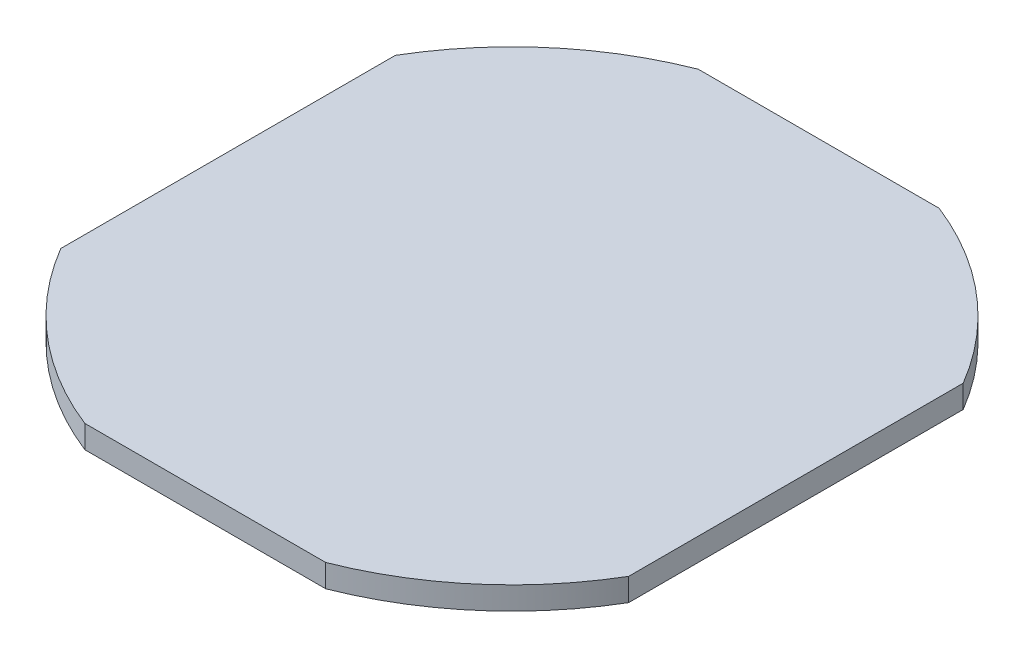
ISO-10303-21;
HEADER;
FILE_DESCRIPTION(('STEP AP214'),'2;1');
FILE_NAME('part.step','',(''),(''),'','','');
FILE_SCHEMA(('AUTOMOTIVE_DESIGN { 1 0 10303 214 1 1 1 1 }'));
ENDSEC;
DATA;
#1=APPLICATION_CONTEXT('core data for automotive mechanical design processes');
#2=APPLICATION_PROTOCOL_DEFINITION('international standard','automotive_design',2000,#1);
#3=PRODUCT_CONTEXT('',#1,'mechanical');
#4=PRODUCT('Part','Part','',(#3));
#5=PRODUCT_RELATED_PRODUCT_CATEGORY('part','',(#4));
#6=PRODUCT_DEFINITION_FORMATION('','',#4);
#7=PRODUCT_DEFINITION_CONTEXT('part definition',#1,'design');
#8=PRODUCT_DEFINITION('design','',#6,#7);
#9=PRODUCT_DEFINITION_SHAPE('','',#8);
#10=(LENGTH_UNIT() NAMED_UNIT(*) SI_UNIT(.MILLI.,.METRE.));
#11=(NAMED_UNIT(*) PLANE_ANGLE_UNIT() SI_UNIT($,.RADIAN.));
#12=(NAMED_UNIT(*) SI_UNIT($,.STERADIAN.) SOLID_ANGLE_UNIT());
#13=UNCERTAINTY_MEASURE_WITH_UNIT(LENGTH_MEASURE(1.E-05),#10,'distance_accuracy_value','');
#14=(GEOMETRIC_REPRESENTATION_CONTEXT(3) GLOBAL_UNCERTAINTY_ASSIGNED_CONTEXT((#13)) GLOBAL_UNIT_ASSIGNED_CONTEXT((#10,
#11,#12)) REPRESENTATION_CONTEXT('',''));
#15=CARTESIAN_POINT('',(0.,0.,0.));
#16=DIRECTION('',(0.,0.,1.));
#17=DIRECTION('',(1.,0.,0.));
#18=AXIS2_PLACEMENT_3D('',#15,#16,#17);
#19=CARTESIAN_POINT('',(0.,5.,0.));
#20=DIRECTION('',(0.,-1.,0.));
#21=DIRECTION('',(0.,0.,-1.));
#22=AXIS2_PLACEMENT_3D('',#19,#20,#21);
#23=CYLINDRICAL_SURFACE('',#22,72.25);
#24=CARTESIAN_POINT('',(0.,0.,0.));
#25=DIRECTION('',(0.,1.,0.));
#26=DIRECTION('',(0.,0.,1.));
#27=AXIS2_PLACEMENT_3D('',#24,#25,#26);
#28=CIRCLE('',#27,72.25);
#29=CARTESIAN_POINT('',(-26.4102252924885,0.,-67.25));
#30=VERTEX_POINT('',#29);
#31=CARTESIAN_POINT('',(-62.25,0.,-36.6742416417844));
#32=VERTEX_POINT('',#31);
#33=EDGE_CURVE('E129',#30,#32,#28,.T.);
#34=ORIENTED_EDGE('',*,*,#33,.T.);
#35=DIRECTION('',(0.,-1.,0.));
#36=VECTOR('',#35,1.);
#37=CARTESIAN_POINT('',(-62.25,5.,-36.6742416417844));
#38=LINE('',#37,#36);
#39=CARTESIAN_POINT('',(-62.25,5.,-36.6742416417844));
#40=VERTEX_POINT('',#39);
#41=EDGE_CURVE('E11',#40,#32,#38,.T.);
#42=ORIENTED_EDGE('',*,*,#41,.F.);
#43=CARTESIAN_POINT('',(0.,5.,0.));
#44=DIRECTION('',(0.,1.,0.));
#45=DIRECTION('',(0.,0.,1.));
#46=AXIS2_PLACEMENT_3D('',#43,#44,#45);
#47=CIRCLE('',#46,72.25);
#48=CARTESIAN_POINT('',(-26.4102252924885,5.,-67.25));
#49=VERTEX_POINT('',#48);
#50=EDGE_CURVE('E143',#49,#40,#47,.T.);
#51=ORIENTED_EDGE('',*,*,#50,.F.);
#52=DIRECTION('',(0.,-1.,0.));
#53=VECTOR('',#52,1.);
#54=CARTESIAN_POINT('',(-26.4102252924885,5.,-67.25));
#55=LINE('',#54,#53);
#56=EDGE_CURVE('E125',#49,#30,#55,.T.);
#57=ORIENTED_EDGE('',*,*,#56,.T.);
#58=EDGE_LOOP('',(#34,#42,#51,#57));
#59=FACE_BOUND('',#58,.T.);
#60=ADVANCED_FACE('F33',(#59),#23,.T.);
#61=CARTESIAN_POINT('',(-62.25,5.,36.6742416417844));
#62=DIRECTION('',(1.,0.,0.));
#63=DIRECTION('',(0.,0.,-1.));
#64=AXIS2_PLACEMENT_3D('',#61,#62,#63);
#65=PLANE('',#64);
#66=DIRECTION('',(0.,0.,1.));
#67=VECTOR('',#66,1.);
#68=CARTESIAN_POINT('',(-62.25,0.,36.6742416417844));
#69=LINE('',#68,#67);
#70=CARTESIAN_POINT('',(-62.25,0.,36.6742416417844));
#71=VERTEX_POINT('',#70);
#72=EDGE_CURVE('E132',#32,#71,#69,.T.);
#73=ORIENTED_EDGE('',*,*,#72,.T.);
#74=DIRECTION('',(0.,-1.,0.));
#75=VECTOR('',#74,1.);
#76=CARTESIAN_POINT('',(-62.25,5.,36.6742416417844));
#77=LINE('',#76,#75);
#78=CARTESIAN_POINT('',(-62.25,5.,36.6742416417844));
#79=VERTEX_POINT('',#78);
#80=EDGE_CURVE('E41',#79,#71,#77,.T.);
#81=ORIENTED_EDGE('',*,*,#80,.F.);
#82=DIRECTION('',(0.,0.,1.));
#83=VECTOR('',#82,1.);
#84=CARTESIAN_POINT('',(-62.25,5.,36.6742416417844));
#85=LINE('',#84,#83);
#86=EDGE_CURVE('E92',#40,#79,#85,.T.);
#87=ORIENTED_EDGE('',*,*,#86,.F.);
#88=ORIENTED_EDGE('',*,*,#41,.T.);
#89=EDGE_LOOP('',(#73,#81,#87,#88));
#90=FACE_BOUND('',#89,.T.);
#91=ADVANCED_FACE('F178',(#90),#65,.F.);
#92=CARTESIAN_POINT('',(0.,5.,0.));
#93=DIRECTION('',(0.,-1.,0.));
#94=DIRECTION('',(0.,0.,-1.));
#95=AXIS2_PLACEMENT_3D('',#92,#93,#94);
#96=CYLINDRICAL_SURFACE('',#95,72.25);
#97=CARTESIAN_POINT('',(0.,0.,0.));
#98=DIRECTION('',(0.,1.,0.));
#99=DIRECTION('',(0.,0.,1.));
#100=AXIS2_PLACEMENT_3D('',#97,#98,#99);
#101=CIRCLE('',#100,72.25);
#102=CARTESIAN_POINT('',(-26.4102252924885,0.,67.25));
#103=VERTEX_POINT('',#102);
#104=EDGE_CURVE('E134',#71,#103,#101,.T.);
#105=ORIENTED_EDGE('',*,*,#104,.T.);
#106=DIRECTION('',(0.,-1.,0.));
#107=VECTOR('',#106,1.);
#108=CARTESIAN_POINT('',(-26.4102252924885,5.,67.25));
#109=LINE('',#108,#107);
#110=CARTESIAN_POINT('',(-26.4102252924885,5.,67.25));
#111=VERTEX_POINT('',#110);
#112=EDGE_CURVE('E150',#111,#103,#109,.T.);
#113=ORIENTED_EDGE('',*,*,#112,.F.);
#114=CARTESIAN_POINT('',(0.,5.,0.));
#115=DIRECTION('',(0.,1.,0.));
#116=DIRECTION('',(0.,0.,1.));
#117=AXIS2_PLACEMENT_3D('',#114,#115,#116);
#118=CIRCLE('',#117,72.25);
#119=EDGE_CURVE('E158',#79,#111,#118,.T.);
#120=ORIENTED_EDGE('',*,*,#119,.F.);
#121=ORIENTED_EDGE('',*,*,#80,.T.);
#122=EDGE_LOOP('',(#105,#113,#120,#121));
#123=FACE_BOUND('',#122,.T.);
#124=ADVANCED_FACE('F156',(#123),#96,.T.);
#125=CARTESIAN_POINT('',(-26.4102252924885,5.,67.25));
#126=DIRECTION('',(0.,0.,-1.));
#127=DIRECTION('',(-1.,0.,0.));
#128=AXIS2_PLACEMENT_3D('',#125,#126,#127);
#129=PLANE('',#128);
#130=DIRECTION('',(1.,0.,0.));
#131=VECTOR('',#130,1.);
#132=CARTESIAN_POINT('',(-26.4102252924885,0.,67.25));
#133=LINE('',#132,#131);
#134=CARTESIAN_POINT('',(26.4102252924885,0.,67.25));
#135=VERTEX_POINT('',#134);
#136=EDGE_CURVE('E136',#103,#135,#133,.T.);
#137=ORIENTED_EDGE('',*,*,#136,.T.);
#138=DIRECTION('',(0.,-1.,0.));
#139=VECTOR('',#138,1.);
#140=CARTESIAN_POINT('',(26.4102252924885,5.,67.25));
#141=LINE('',#140,#139);
#142=CARTESIAN_POINT('',(26.4102252924885,5.,67.25));
#143=VERTEX_POINT('',#142);
#144=EDGE_CURVE('E147',#143,#135,#141,.T.);
#145=ORIENTED_EDGE('',*,*,#144,.F.);
#146=DIRECTION('',(1.,0.,0.));
#147=VECTOR('',#146,1.);
#148=CARTESIAN_POINT('',(-26.4102252924885,5.,67.25));
#149=LINE('',#148,#147);
#150=EDGE_CURVE('E170',#111,#143,#149,.T.);
#151=ORIENTED_EDGE('',*,*,#150,.F.);
#152=ORIENTED_EDGE('',*,*,#112,.T.);
#153=EDGE_LOOP('',(#137,#145,#151,#152));
#154=FACE_BOUND('',#153,.T.);
#155=ADVANCED_FACE('F166',(#154),#129,.F.);
#156=CARTESIAN_POINT('',(0.,5.,0.));
#157=DIRECTION('',(0.,-1.,0.));
#158=DIRECTION('',(0.,0.,-1.));
#159=AXIS2_PLACEMENT_3D('',#156,#157,#158);
#160=CYLINDRICAL_SURFACE('',#159,72.25);
#161=CARTESIAN_POINT('',(0.,0.,0.));
#162=DIRECTION('',(0.,1.,0.));
#163=DIRECTION('',(0.,0.,1.));
#164=AXIS2_PLACEMENT_3D('',#161,#162,#163);
#165=CIRCLE('',#164,72.25);
#166=CARTESIAN_POINT('',(62.25,0.,36.6742416417845));
#167=VERTEX_POINT('',#166);
#168=EDGE_CURVE('E138',#135,#167,#165,.T.);
#169=ORIENTED_EDGE('',*,*,#168,.T.);
#170=DIRECTION('',(0.,-1.,0.));
#171=VECTOR('',#170,1.);
#172=CARTESIAN_POINT('',(62.25,5.,36.6742416417845));
#173=LINE('',#172,#171);
#174=CARTESIAN_POINT('',(62.25,5.,36.6742416417845));
#175=VERTEX_POINT('',#174);
#176=EDGE_CURVE('E120',#175,#167,#173,.T.);
#177=ORIENTED_EDGE('',*,*,#176,.F.);
#178=CARTESIAN_POINT('',(0.,5.,0.));
#179=DIRECTION('',(0.,1.,0.));
#180=DIRECTION('',(0.,0.,1.));
#181=AXIS2_PLACEMENT_3D('',#178,#179,#180);
#182=CIRCLE('',#181,72.25);
#183=EDGE_CURVE('E111',#143,#175,#182,.T.);
#184=ORIENTED_EDGE('',*,*,#183,.F.);
#185=ORIENTED_EDGE('',*,*,#144,.T.);
#186=EDGE_LOOP('',(#169,#177,#184,#185));
#187=FACE_BOUND('',#186,.T.);
#188=ADVANCED_FACE('F169',(#187),#160,.T.);
#189=CARTESIAN_POINT('',(62.25,5.,36.6742416417845));
#190=DIRECTION('',(-1.,0.,0.));
#191=DIRECTION('',(0.,0.,1.));
#192=AXIS2_PLACEMENT_3D('',#189,#190,#191);
#193=PLANE('',#192);
#194=DIRECTION('',(0.,0.,-1.));
#195=VECTOR('',#194,1.);
#196=CARTESIAN_POINT('',(62.25,0.,36.6742416417845));
#197=LINE('',#196,#195);
#198=CARTESIAN_POINT('',(62.25,0.,-36.6742416417845));
#199=VERTEX_POINT('',#198);
#200=EDGE_CURVE('E119',#167,#199,#197,.T.);
#201=ORIENTED_EDGE('',*,*,#200,.T.);
#202=DIRECTION('',(0.,-1.,0.));
#203=VECTOR('',#202,1.);
#204=CARTESIAN_POINT('',(62.25,5.,-36.6742416417845));
#205=LINE('',#204,#203);
#206=CARTESIAN_POINT('',(62.25,5.,-36.6742416417845));
#207=VERTEX_POINT('',#206);
#208=EDGE_CURVE('E116',#207,#199,#205,.T.);
#209=ORIENTED_EDGE('',*,*,#208,.F.);
#210=DIRECTION('',(0.,0.,-1.));
#211=VECTOR('',#210,1.);
#212=CARTESIAN_POINT('',(62.25,5.,36.6742416417845));
#213=LINE('',#212,#211);
#214=EDGE_CURVE('E105',#175,#207,#213,.T.);
#215=ORIENTED_EDGE('',*,*,#214,.F.);
#216=ORIENTED_EDGE('',*,*,#176,.T.);
#217=EDGE_LOOP('',(#201,#209,#215,#216));
#218=FACE_BOUND('',#217,.T.);
#219=ADVANCED_FACE('F117',(#218),#193,.F.);
#220=CARTESIAN_POINT('',(0.,5.,0.));
#221=DIRECTION('',(0.,-1.,0.));
#222=DIRECTION('',(0.,0.,-1.));
#223=AXIS2_PLACEMENT_3D('',#220,#221,#222);
#224=CYLINDRICAL_SURFACE('',#223,72.25);
#225=CARTESIAN_POINT('',(0.,0.,0.));
#226=DIRECTION('',(0.,1.,0.));
#227=DIRECTION('',(0.,0.,1.));
#228=AXIS2_PLACEMENT_3D('',#225,#226,#227);
#229=CIRCLE('',#228,72.25);
#230=CARTESIAN_POINT('',(26.4102252924885,0.,-67.25));
#231=VERTEX_POINT('',#230);
#232=EDGE_CURVE('E78',#199,#231,#229,.T.);
#233=ORIENTED_EDGE('',*,*,#232,.T.);
#234=DIRECTION('',(0.,-1.,0.));
#235=VECTOR('',#234,1.);
#236=CARTESIAN_POINT('',(26.4102252924885,5.,-67.25));
#237=LINE('',#236,#235);
#238=CARTESIAN_POINT('',(26.4102252924885,5.,-67.25));
#239=VERTEX_POINT('',#238);
#240=EDGE_CURVE('E121',#239,#231,#237,.T.);
#241=ORIENTED_EDGE('',*,*,#240,.F.);
#242=CARTESIAN_POINT('',(0.,5.,0.));
#243=DIRECTION('',(0.,1.,0.));
#244=DIRECTION('',(0.,0.,1.));
#245=AXIS2_PLACEMENT_3D('',#242,#243,#244);
#246=CIRCLE('',#245,72.25);
#247=EDGE_CURVE('E109',#207,#239,#246,.T.);
#248=ORIENTED_EDGE('',*,*,#247,.F.);
#249=ORIENTED_EDGE('',*,*,#208,.T.);
#250=EDGE_LOOP('',(#233,#241,#248,#249));
#251=FACE_BOUND('',#250,.T.);
#252=ADVANCED_FACE('F123',(#251),#224,.T.);
#253=CARTESIAN_POINT('',(-26.4102252924885,5.,-67.25));
#254=DIRECTION('',(0.,0.,1.));
#255=DIRECTION('',(1.,0.,0.));
#256=AXIS2_PLACEMENT_3D('',#253,#254,#255);
#257=PLANE('',#256);
#258=DIRECTION('',(-1.,0.,0.));
#259=VECTOR('',#258,1.);
#260=CARTESIAN_POINT('',(-26.4102252924885,0.,-67.25));
#261=LINE('',#260,#259);
#262=EDGE_CURVE('E84',#231,#30,#261,.T.);
#263=ORIENTED_EDGE('',*,*,#262,.T.);
#264=ORIENTED_EDGE('',*,*,#56,.F.);
#265=DIRECTION('',(-1.,0.,0.));
#266=VECTOR('',#265,1.);
#267=CARTESIAN_POINT('',(-26.4102252924885,5.,-67.25));
#268=LINE('',#267,#266);
#269=EDGE_CURVE('E49',#239,#49,#268,.T.);
#270=ORIENTED_EDGE('',*,*,#269,.F.);
#271=ORIENTED_EDGE('',*,*,#240,.T.);
#272=EDGE_LOOP('',(#263,#264,#270,#271));
#273=FACE_BOUND('',#272,.T.);
#274=ADVANCED_FACE('F194',(#273),#257,.F.);
#275=CARTESIAN_POINT('',(0.,5.,0.));
#276=DIRECTION('',(0.,1.,0.));
#277=DIRECTION('',(0.,0.,1.));
#278=AXIS2_PLACEMENT_3D('',#275,#276,#277);
#279=PLANE('',#278);
#280=ORIENTED_EDGE('',*,*,#50,.T.);
#281=ORIENTED_EDGE('',*,*,#86,.T.);
#282=ORIENTED_EDGE('',*,*,#119,.T.);
#283=ORIENTED_EDGE('',*,*,#150,.T.);
#284=ORIENTED_EDGE('',*,*,#183,.T.);
#285=ORIENTED_EDGE('',*,*,#214,.T.);
#286=ORIENTED_EDGE('',*,*,#247,.T.);
#287=ORIENTED_EDGE('',*,*,#269,.T.);
#288=EDGE_LOOP('',(#280,#281,#282,#283,#284,#285,#286,#287));
#289=FACE_BOUND('',#288,.T.);
#290=ADVANCED_FACE('F107',(#289),#279,.T.);
#291=CARTESIAN_POINT('',(0.,0.,0.));
#292=DIRECTION('',(0.,1.,0.));
#293=DIRECTION('',(0.,0.,1.));
#294=AXIS2_PLACEMENT_3D('',#291,#292,#293);
#295=PLANE('',#294);
#296=ORIENTED_EDGE('',*,*,#33,.F.);
#297=ORIENTED_EDGE('',*,*,#262,.F.);
#298=ORIENTED_EDGE('',*,*,#232,.F.);
#299=ORIENTED_EDGE('',*,*,#200,.F.);
#300=ORIENTED_EDGE('',*,*,#168,.F.);
#301=ORIENTED_EDGE('',*,*,#136,.F.);
#302=ORIENTED_EDGE('',*,*,#104,.F.);
#303=ORIENTED_EDGE('',*,*,#72,.F.);
#304=EDGE_LOOP('',(#296,#297,#298,#299,#300,#301,#302,#303));
#305=FACE_BOUND('',#304,.T.);
#306=ADVANCED_FACE('F162',(#305),#295,.F.);
#307=CLOSED_SHELL('',(#60,#91,#124,#155,#188,#219,#252,#274,#290,#306));
#308=MANIFOLD_SOLID_BREP('B2',#307);
#309=ADVANCED_BREP_SHAPE_REPRESENTATION('',(#18,#308),#14);
#310=SHAPE_DEFINITION_REPRESENTATION(#9,#309);
ENDSEC;
END-ISO-10303-21;
